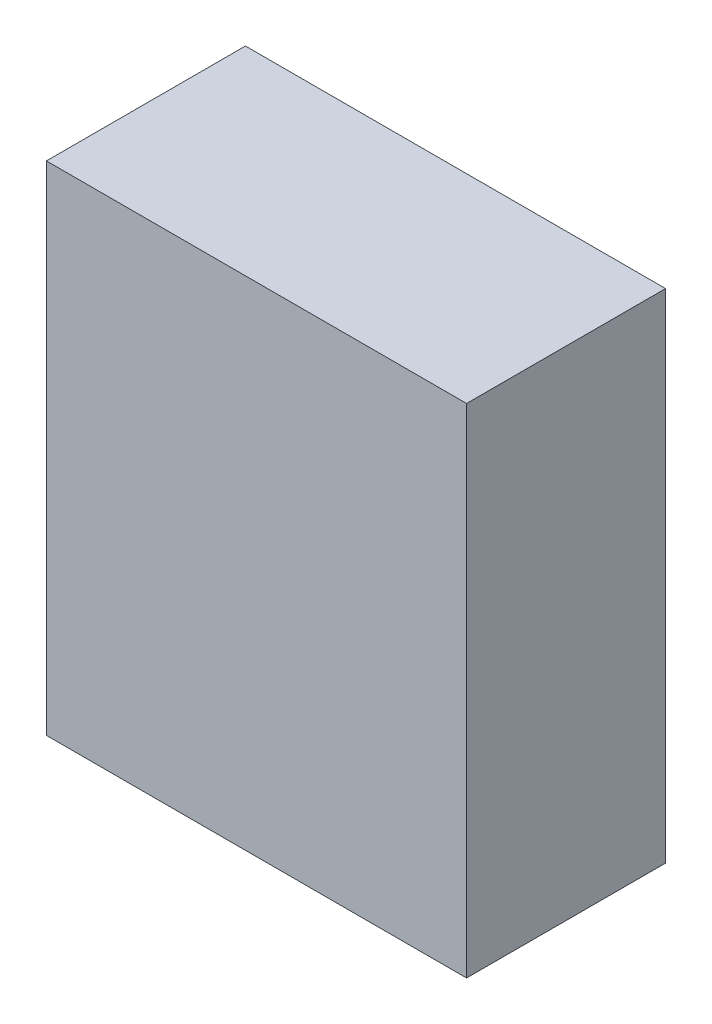
ISO-10303-21;
HEADER;
FILE_DESCRIPTION(('STEP AP214'),'2;1');
FILE_NAME('part.step','',(''),(''),'','','');
FILE_SCHEMA(('AUTOMOTIVE_DESIGN { 1 0 10303 214 1 1 1 1 }'));
ENDSEC;
DATA;
#1=APPLICATION_CONTEXT('core data for automotive mechanical design processes');
#2=APPLICATION_PROTOCOL_DEFINITION('international standard','automotive_design',2000,#1);
#3=PRODUCT_CONTEXT('',#1,'mechanical');
#4=PRODUCT('Part','Part','',(#3));
#5=PRODUCT_RELATED_PRODUCT_CATEGORY('part','',(#4));
#6=PRODUCT_DEFINITION_FORMATION('','',#4);
#7=PRODUCT_DEFINITION_CONTEXT('part definition',#1,'design');
#8=PRODUCT_DEFINITION('design','',#6,#7);
#9=PRODUCT_DEFINITION_SHAPE('','',#8);
#10=(LENGTH_UNIT() NAMED_UNIT(*) SI_UNIT(.MILLI.,.METRE.));
#11=(NAMED_UNIT(*) PLANE_ANGLE_UNIT() SI_UNIT($,.RADIAN.));
#12=(NAMED_UNIT(*) SI_UNIT($,.STERADIAN.) SOLID_ANGLE_UNIT());
#13=UNCERTAINTY_MEASURE_WITH_UNIT(LENGTH_MEASURE(1.E-05),#10,'distance_accuracy_value','');
#14=(GEOMETRIC_REPRESENTATION_CONTEXT(3) GLOBAL_UNCERTAINTY_ASSIGNED_CONTEXT((#13)) GLOBAL_UNIT_ASSIGNED_CONTEXT((#10,
#11,#12)) REPRESENTATION_CONTEXT('',''));
#15=CARTESIAN_POINT('',(0.,0.,0.));
#16=DIRECTION('',(0.,0.,1.));
#17=DIRECTION('',(1.,0.,0.));
#18=AXIS2_PLACEMENT_3D('',#15,#16,#17);
#19=CARTESIAN_POINT('',(0.,1143.,0.));
#20=DIRECTION('',(1.,0.,0.));
#21=DIRECTION('',(0.,0.,-1.));
#22=AXIS2_PLACEMENT_3D('',#19,#20,#21);
#23=PLANE('',#22);
#24=DIRECTION('',(0.,0.,1.));
#25=VECTOR('',#24,1.);
#26=CARTESIAN_POINT('',(0.,0.,0.));
#27=LINE('',#26,#25);
#28=CARTESIAN_POINT('',(0.,0.,-457.2));
#29=VERTEX_POINT('',#28);
#30=CARTESIAN_POINT('',(0.,0.,0.));
#31=VERTEX_POINT('',#30);
#32=EDGE_CURVE('E94',#29,#31,#27,.T.);
#33=ORIENTED_EDGE('',*,*,#32,.T.);
#34=DIRECTION('',(0.,-1.,0.));
#35=VECTOR('',#34,1.);
#36=CARTESIAN_POINT('',(0.,1143.,0.));
#37=LINE('',#36,#35);
#38=CARTESIAN_POINT('',(0.,1143.,0.));
#39=VERTEX_POINT('',#38);
#40=EDGE_CURVE('E11',#39,#31,#37,.T.);
#41=ORIENTED_EDGE('',*,*,#40,.F.);
#42=DIRECTION('',(0.,0.,1.));
#43=VECTOR('',#42,1.);
#44=CARTESIAN_POINT('',(0.,1143.,0.));
#45=LINE('',#44,#43);
#46=CARTESIAN_POINT('',(0.,1143.,-457.2));
#47=VERTEX_POINT('',#46);
#48=EDGE_CURVE('E82',#47,#39,#45,.T.);
#49=ORIENTED_EDGE('',*,*,#48,.F.);
#50=DIRECTION('',(0.,-1.,0.));
#51=VECTOR('',#50,1.);
#52=CARTESIAN_POINT('',(0.,1143.,-457.2));
#53=LINE('',#52,#51);
#54=EDGE_CURVE('E90',#47,#29,#53,.T.);
#55=ORIENTED_EDGE('',*,*,#54,.T.);
#56=EDGE_LOOP('',(#33,#41,#49,#55));
#57=FACE_BOUND('',#56,.T.);
#58=ADVANCED_FACE('F31',(#57),#23,.F.);
#59=CARTESIAN_POINT('',(0.,1143.,0.));
#60=DIRECTION('',(0.,0.,-1.));
#61=DIRECTION('',(-1.,0.,0.));
#62=AXIS2_PLACEMENT_3D('',#59,#60,#61);
#63=PLANE('',#62);
#64=DIRECTION('',(1.,0.,0.));
#65=VECTOR('',#64,1.);
#66=CARTESIAN_POINT('',(0.,0.,0.));
#67=LINE('',#66,#65);
#68=CARTESIAN_POINT('',(965.2,0.,0.));
#69=VERTEX_POINT('',#68);
#70=EDGE_CURVE('E86',#31,#69,#67,.T.);
#71=ORIENTED_EDGE('',*,*,#70,.T.);
#72=DIRECTION('',(0.,-1.,0.));
#73=VECTOR('',#72,1.);
#74=CARTESIAN_POINT('',(965.2,1143.,0.));
#75=LINE('',#74,#73);
#76=CARTESIAN_POINT('',(965.2,1143.,0.));
#77=VERTEX_POINT('',#76);
#78=EDGE_CURVE('E39',#77,#69,#75,.T.);
#79=ORIENTED_EDGE('',*,*,#78,.F.);
#80=DIRECTION('',(1.,0.,0.));
#81=VECTOR('',#80,1.);
#82=CARTESIAN_POINT('',(0.,1143.,0.));
#83=LINE('',#82,#81);
#84=EDGE_CURVE('E77',#39,#77,#83,.T.);
#85=ORIENTED_EDGE('',*,*,#84,.F.);
#86=ORIENTED_EDGE('',*,*,#40,.T.);
#87=EDGE_LOOP('',(#71,#79,#85,#86));
#88=FACE_BOUND('',#87,.T.);
#89=ADVANCED_FACE('F85',(#88),#63,.F.);
#90=CARTESIAN_POINT('',(965.2,1143.,0.));
#91=DIRECTION('',(-1.,0.,0.));
#92=DIRECTION('',(0.,0.,1.));
#93=AXIS2_PLACEMENT_3D('',#90,#91,#92);
#94=PLANE('',#93);
#95=DIRECTION('',(0.,0.,-1.));
#96=VECTOR('',#95,1.);
#97=CARTESIAN_POINT('',(965.2,0.,0.));
#98=LINE('',#97,#96);
#99=CARTESIAN_POINT('',(965.2,0.,-457.2));
#100=VERTEX_POINT('',#99);
#101=EDGE_CURVE('E64',#69,#100,#98,.T.);
#102=ORIENTED_EDGE('',*,*,#101,.T.);
#103=DIRECTION('',(0.,-1.,0.));
#104=VECTOR('',#103,1.);
#105=CARTESIAN_POINT('',(965.2,1143.,-457.2));
#106=LINE('',#105,#104);
#107=CARTESIAN_POINT('',(965.2,1143.,-457.2));
#108=VERTEX_POINT('',#107);
#109=EDGE_CURVE('E87',#108,#100,#106,.T.);
#110=ORIENTED_EDGE('',*,*,#109,.F.);
#111=DIRECTION('',(0.,0.,-1.));
#112=VECTOR('',#111,1.);
#113=CARTESIAN_POINT('',(965.2,1143.,0.));
#114=LINE('',#113,#112);
#115=EDGE_CURVE('E80',#77,#108,#114,.T.);
#116=ORIENTED_EDGE('',*,*,#115,.F.);
#117=ORIENTED_EDGE('',*,*,#78,.T.);
#118=EDGE_LOOP('',(#102,#110,#116,#117));
#119=FACE_BOUND('',#118,.T.);
#120=ADVANCED_FACE('F88',(#119),#94,.F.);
#121=CARTESIAN_POINT('',(0.,1143.,-457.2));
#122=DIRECTION('',(0.,0.,1.));
#123=DIRECTION('',(1.,0.,0.));
#124=AXIS2_PLACEMENT_3D('',#121,#122,#123);
#125=PLANE('',#124);
#126=DIRECTION('',(-1.,0.,0.));
#127=VECTOR('',#126,1.);
#128=CARTESIAN_POINT('',(0.,0.,-457.2));
#129=LINE('',#128,#127);
#130=EDGE_CURVE('E70',#100,#29,#129,.T.);
#131=ORIENTED_EDGE('',*,*,#130,.T.);
#132=ORIENTED_EDGE('',*,*,#54,.F.);
#133=DIRECTION('',(-1.,0.,0.));
#134=VECTOR('',#133,1.);
#135=CARTESIAN_POINT('',(0.,1143.,-457.2));
#136=LINE('',#135,#134);
#137=EDGE_CURVE('E47',#108,#47,#136,.T.);
#138=ORIENTED_EDGE('',*,*,#137,.F.);
#139=ORIENTED_EDGE('',*,*,#109,.T.);
#140=EDGE_LOOP('',(#131,#132,#138,#139));
#141=FACE_BOUND('',#140,.T.);
#142=ADVANCED_FACE('F101',(#141),#125,.F.);
#143=CARTESIAN_POINT('',(0.,1143.,-457.2));
#144=DIRECTION('',(0.,-1.,0.));
#145=DIRECTION('',(0.,0.,-1.));
#146=AXIS2_PLACEMENT_3D('',#143,#144,#145);
#147=PLANE('',#146);
#148=ORIENTED_EDGE('',*,*,#48,.T.);
#149=ORIENTED_EDGE('',*,*,#84,.T.);
#150=ORIENTED_EDGE('',*,*,#115,.T.);
#151=ORIENTED_EDGE('',*,*,#137,.T.);
#152=EDGE_LOOP('',(#148,#149,#150,#151));
#153=FACE_BOUND('',#152,.T.);
#154=ADVANCED_FACE('F78',(#153),#147,.F.);
#155=CARTESIAN_POINT('',(0.,0.,-457.2));
#156=DIRECTION('',(0.,-1.,0.));
#157=DIRECTION('',(0.,0.,-1.));
#158=AXIS2_PLACEMENT_3D('',#155,#156,#157);
#159=PLANE('',#158);
#160=ORIENTED_EDGE('',*,*,#32,.F.);
#161=ORIENTED_EDGE('',*,*,#130,.F.);
#162=ORIENTED_EDGE('',*,*,#101,.F.);
#163=ORIENTED_EDGE('',*,*,#70,.F.);
#164=EDGE_LOOP('',(#160,#161,#162,#163));
#165=FACE_BOUND('',#164,.T.);
#166=ADVANCED_FACE('F104',(#165),#159,.T.);
#167=CLOSED_SHELL('',(#58,#89,#120,#142,#154,#166));
#168=MANIFOLD_SOLID_BREP('B2',#167);
#169=ADVANCED_BREP_SHAPE_REPRESENTATION('',(#18,#168),#14);
#170=SHAPE_DEFINITION_REPRESENTATION(#9,#169);
ENDSEC;
END-ISO-10303-21;
